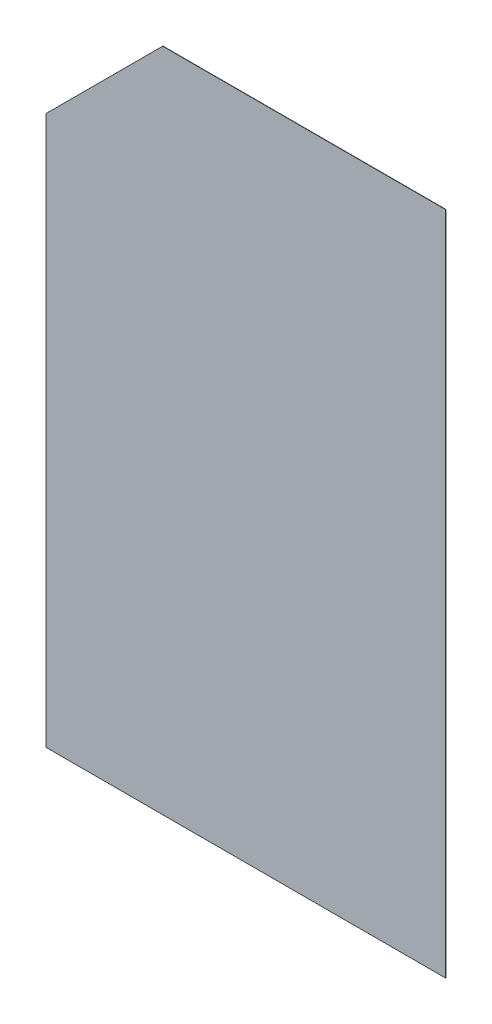
ISO-10303-21;
HEADER;
FILE_DESCRIPTION(('STEP AP214'),'2;1');
FILE_NAME('part.step','',(''),(''),'','','');
FILE_SCHEMA(('AUTOMOTIVE_DESIGN { 1 0 10303 214 1 1 1 1 }'));
ENDSEC;
DATA;
#1=APPLICATION_CONTEXT('core data for automotive mechanical design processes');
#2=APPLICATION_PROTOCOL_DEFINITION('international standard','automotive_design',2000,#1);
#3=PRODUCT_CONTEXT('',#1,'mechanical');
#4=PRODUCT('Part','Part','',(#3));
#5=PRODUCT_RELATED_PRODUCT_CATEGORY('part','',(#4));
#6=PRODUCT_DEFINITION_FORMATION('','',#4);
#7=PRODUCT_DEFINITION_CONTEXT('part definition',#1,'design');
#8=PRODUCT_DEFINITION('design','',#6,#7);
#9=PRODUCT_DEFINITION_SHAPE('','',#8);
#10=(LENGTH_UNIT() NAMED_UNIT(*) SI_UNIT(.MILLI.,.METRE.));
#11=(NAMED_UNIT(*) PLANE_ANGLE_UNIT() SI_UNIT($,.RADIAN.));
#12=(NAMED_UNIT(*) SI_UNIT($,.STERADIAN.) SOLID_ANGLE_UNIT());
#13=UNCERTAINTY_MEASURE_WITH_UNIT(LENGTH_MEASURE(1.E-05),#10,'distance_accuracy_value','');
#14=(GEOMETRIC_REPRESENTATION_CONTEXT(3) GLOBAL_UNCERTAINTY_ASSIGNED_CONTEXT((#13)) GLOBAL_UNIT_ASSIGNED_CONTEXT((#10,
#11,#12)) REPRESENTATION_CONTEXT('',''));
#15=CARTESIAN_POINT('',(0.,0.,0.));
#16=DIRECTION('',(0.,0.,1.));
#17=DIRECTION('',(1.,0.,0.));
#18=AXIS2_PLACEMENT_3D('',#15,#16,#17);
#19=CARTESIAN_POINT('',(0.,0.,0.001));
#20=DIRECTION('',(0.,0.,-1.));
#21=DIRECTION('',(-1.,0.,0.));
#22=AXIS2_PLACEMENT_3D('',#19,#20,#21);
#23=PLANE('',#22);
#24=DIRECTION('',(0.,1.,0.));
#25=VECTOR('',#24,1.);
#26=CARTESIAN_POINT('',(1.2,0.,0.001));
#27=LINE('',#26,#25);
#28=CARTESIAN_POINT('',(1.2,0.,0.001));
#29=VERTEX_POINT('',#28);
#30=CARTESIAN_POINT('',(1.2,2.,0.001));
#31=VERTEX_POINT('',#30);
#32=EDGE_CURVE('E85',#29,#31,#27,.T.);
#33=ORIENTED_EDGE('',*,*,#32,.T.);
#34=DIRECTION('',(1.,0.,0.));
#35=VECTOR('',#34,1.);
#36=CARTESIAN_POINT('',(1.2,2.,0.001));
#37=LINE('',#36,#35);
#38=CARTESIAN_POINT('',(0.35,2.,0.001));
#39=VERTEX_POINT('',#38);
#40=EDGE_CURVE('E66',#31,#39,#37,.F.);
#41=ORIENTED_EDGE('',*,*,#40,.T.);
#42=DIRECTION('',(0.707106781186548,0.707106781186548,0.));
#43=VECTOR('',#42,1.);
#44=CARTESIAN_POINT('',(0.35,2.,0.001));
#45=LINE('',#44,#43);
#46=CARTESIAN_POINT('',(0.,1.65,0.001));
#47=VERTEX_POINT('',#46);
#48=EDGE_CURVE('E60',#39,#47,#45,.F.);
#49=ORIENTED_EDGE('',*,*,#48,.T.);
#50=DIRECTION('',(0.,1.,0.));
#51=VECTOR('',#50,1.);
#52=CARTESIAN_POINT('',(0.,1.65,0.001));
#53=LINE('',#52,#51);
#54=CARTESIAN_POINT('',(0.,0.,0.001));
#55=VERTEX_POINT('',#54);
#56=EDGE_CURVE('E63',#47,#55,#53,.F.);
#57=ORIENTED_EDGE('',*,*,#56,.T.);
#58=DIRECTION('',(-1.,0.,0.));
#59=VECTOR('',#58,1.);
#60=CARTESIAN_POINT('',(0.,0.,0.001));
#61=LINE('',#60,#59);
#62=EDGE_CURVE('E77',#29,#55,#61,.T.);
#63=ORIENTED_EDGE('',*,*,#62,.F.);
#64=EDGE_LOOP('',(#33,#41,#49,#57,#63));
#65=FACE_BOUND('',#64,.T.);
#66=ADVANCED_FACE('F16',(#65),#23,.F.);
#67=CARTESIAN_POINT('',(0.,1.65,0.));
#68=DIRECTION('',(1.,0.,0.));
#69=DIRECTION('',(0.,0.,-1.));
#70=AXIS2_PLACEMENT_3D('',#67,#68,#69);
#71=PLANE('',#70);
#72=DIRECTION('',(0.,0.,-1.));
#73=VECTOR('',#72,1.);
#74=CARTESIAN_POINT('',(0.,0.,0.));
#75=LINE('',#74,#73);
#76=CARTESIAN_POINT('',(0.,0.,0.));
#77=VERTEX_POINT('',#76);
#78=EDGE_CURVE('E76',#77,#55,#75,.F.);
#79=ORIENTED_EDGE('',*,*,#78,.T.);
#80=ORIENTED_EDGE('',*,*,#56,.F.);
#81=DIRECTION('',(0.,0.,-1.));
#82=VECTOR('',#81,1.);
#83=CARTESIAN_POINT('',(0.,1.65,0.));
#84=LINE('',#83,#82);
#85=CARTESIAN_POINT('',(0.,1.65,0.));
#86=VERTEX_POINT('',#85);
#87=EDGE_CURVE('E19',#47,#86,#84,.T.);
#88=ORIENTED_EDGE('',*,*,#87,.T.);
#89=DIRECTION('',(0.,1.,0.));
#90=VECTOR('',#89,1.);
#91=CARTESIAN_POINT('',(0.,0.,0.));
#92=LINE('',#91,#90);
#93=EDGE_CURVE('E90',#77,#86,#92,.T.);
#94=ORIENTED_EDGE('',*,*,#93,.F.);
#95=EDGE_LOOP('',(#79,#80,#88,#94));
#96=FACE_BOUND('',#95,.T.);
#97=ADVANCED_FACE('F73',(#96),#71,.F.);
#98=CARTESIAN_POINT('',(0.35,2.,0.));
#99=DIRECTION('',(0.707106781186548,-0.707106781186548,0.));
#100=DIRECTION('',(0.707106781186548,0.707106781186548,0.));
#101=AXIS2_PLACEMENT_3D('',#98,#99,#100);
#102=PLANE('',#101);
#103=ORIENTED_EDGE('',*,*,#87,.F.);
#104=ORIENTED_EDGE('',*,*,#48,.F.);
#105=DIRECTION('',(0.,0.,1.));
#106=VECTOR('',#105,1.);
#107=CARTESIAN_POINT('',(0.35,2.,0.));
#108=LINE('',#107,#106);
#109=CARTESIAN_POINT('',(0.35,2.,0.));
#110=VERTEX_POINT('',#109);
#111=EDGE_CURVE('E83',#39,#110,#108,.F.);
#112=ORIENTED_EDGE('',*,*,#111,.T.);
#113=DIRECTION('',(0.707106781186547,0.707106781186548,0.));
#114=VECTOR('',#113,1.);
#115=CARTESIAN_POINT('',(0.,1.65,0.));
#116=LINE('',#115,#114);
#117=EDGE_CURVE('E81',#86,#110,#116,.T.);
#118=ORIENTED_EDGE('',*,*,#117,.F.);
#119=EDGE_LOOP('',(#103,#104,#112,#118));
#120=FACE_BOUND('',#119,.T.);
#121=ADVANCED_FACE('F79',(#120),#102,.F.);
#122=CARTESIAN_POINT('',(1.2,2.,0.));
#123=DIRECTION('',(0.,-1.,0.));
#124=DIRECTION('',(0.,0.,-1.));
#125=AXIS2_PLACEMENT_3D('',#122,#123,#124);
#126=PLANE('',#125);
#127=ORIENTED_EDGE('',*,*,#111,.F.);
#128=ORIENTED_EDGE('',*,*,#40,.F.);
#129=DIRECTION('',(0.,0.,-1.));
#130=VECTOR('',#129,1.);
#131=CARTESIAN_POINT('',(1.2,2.,0.));
#132=LINE('',#131,#130);
#133=CARTESIAN_POINT('',(1.2,2.,0.));
#134=VERTEX_POINT('',#133);
#135=EDGE_CURVE('E95',#31,#134,#132,.T.);
#136=ORIENTED_EDGE('',*,*,#135,.T.);
#137=DIRECTION('',(-1.,0.,0.));
#138=VECTOR('',#137,1.);
#139=CARTESIAN_POINT('',(0.,2.,0.));
#140=LINE('',#139,#138);
#141=EDGE_CURVE('E88',#110,#134,#140,.F.);
#142=ORIENTED_EDGE('',*,*,#141,.F.);
#143=EDGE_LOOP('',(#127,#128,#136,#142));
#144=FACE_BOUND('',#143,.T.);
#145=ADVANCED_FACE('F105',(#144),#126,.F.);
#146=CARTESIAN_POINT('',(1.2,0.,0.));
#147=DIRECTION('',(-1.,0.,0.));
#148=DIRECTION('',(0.,0.,1.));
#149=AXIS2_PLACEMENT_3D('',#146,#147,#148);
#150=PLANE('',#149);
#151=ORIENTED_EDGE('',*,*,#135,.F.);
#152=ORIENTED_EDGE('',*,*,#32,.F.);
#153=DIRECTION('',(0.,0.,1.));
#154=VECTOR('',#153,1.);
#155=CARTESIAN_POINT('',(1.2,0.,0.));
#156=LINE('',#155,#154);
#157=CARTESIAN_POINT('',(1.2,0.,0.));
#158=VERTEX_POINT('',#157);
#159=EDGE_CURVE('E34',#29,#158,#156,.F.);
#160=ORIENTED_EDGE('',*,*,#159,.T.);
#161=DIRECTION('',(0.,1.,0.));
#162=VECTOR('',#161,1.);
#163=CARTESIAN_POINT('',(1.2,0.,0.));
#164=LINE('',#163,#162);
#165=EDGE_CURVE('E25',#134,#158,#164,.F.);
#166=ORIENTED_EDGE('',*,*,#165,.F.);
#167=EDGE_LOOP('',(#151,#152,#160,#166));
#168=FACE_BOUND('',#167,.T.);
#169=ADVANCED_FACE('F106',(#168),#150,.F.);
#170=CARTESIAN_POINT('',(0.,0.,0.));
#171=DIRECTION('',(0.,1.,0.));
#172=DIRECTION('',(0.,0.,1.));
#173=AXIS2_PLACEMENT_3D('',#170,#171,#172);
#174=PLANE('',#173);
#175=ORIENTED_EDGE('',*,*,#159,.F.);
#176=ORIENTED_EDGE('',*,*,#62,.T.);
#177=ORIENTED_EDGE('',*,*,#78,.F.);
#178=DIRECTION('',(-1.,0.,0.));
#179=VECTOR('',#178,1.);
#180=CARTESIAN_POINT('',(0.,0.,0.));
#181=LINE('',#180,#179);
#182=EDGE_CURVE('E11',#158,#77,#181,.T.);
#183=ORIENTED_EDGE('',*,*,#182,.F.);
#184=EDGE_LOOP('',(#175,#176,#177,#183));
#185=FACE_BOUND('',#184,.T.);
#186=ADVANCED_FACE('F108',(#185),#174,.F.);
#187=CARTESIAN_POINT('',(0.,0.,0.));
#188=DIRECTION('',(0.,0.,-1.));
#189=DIRECTION('',(-1.,0.,0.));
#190=AXIS2_PLACEMENT_3D('',#187,#188,#189);
#191=PLANE('',#190);
#192=ORIENTED_EDGE('',*,*,#165,.T.);
#193=ORIENTED_EDGE('',*,*,#182,.T.);
#194=ORIENTED_EDGE('',*,*,#93,.T.);
#195=ORIENTED_EDGE('',*,*,#117,.T.);
#196=ORIENTED_EDGE('',*,*,#141,.T.);
#197=EDGE_LOOP('',(#192,#193,#194,#195,#196));
#198=FACE_BOUND('',#197,.T.);
#199=ADVANCED_FACE('F104',(#198),#191,.T.);
#200=CLOSED_SHELL('',(#66,#97,#121,#145,#169,#186,#199));
#201=MANIFOLD_SOLID_BREP('B1',#200);
#202=ADVANCED_BREP_SHAPE_REPRESENTATION('',(#18,#201),#14);
#203=SHAPE_DEFINITION_REPRESENTATION(#9,#202);
ENDSEC;
END-ISO-10303-21;
